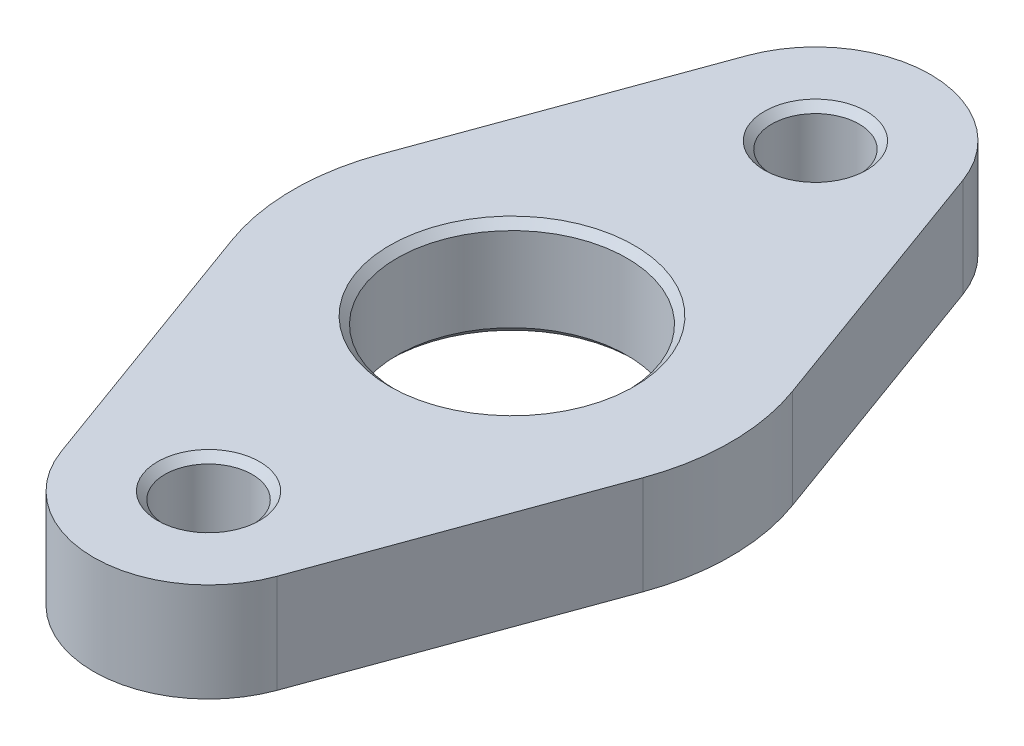
ISO-10303-21;
HEADER;
FILE_DESCRIPTION(('STEP AP214'),'2;1');
FILE_NAME('part.step','',(''),(''),'','','');
FILE_SCHEMA(('AUTOMOTIVE_DESIGN { 1 0 10303 214 1 1 1 1 }'));
ENDSEC;
DATA;
#1=APPLICATION_CONTEXT('core data for automotive mechanical design processes');
#2=APPLICATION_PROTOCOL_DEFINITION('international standard','automotive_design',2000,#1);
#3=PRODUCT_CONTEXT('',#1,'mechanical');
#4=PRODUCT('Part','Part','',(#3));
#5=PRODUCT_RELATED_PRODUCT_CATEGORY('part','',(#4));
#6=PRODUCT_DEFINITION_FORMATION('','',#4);
#7=PRODUCT_DEFINITION_CONTEXT('part definition',#1,'design');
#8=PRODUCT_DEFINITION('design','',#6,#7);
#9=PRODUCT_DEFINITION_SHAPE('','',#8);
#10=(LENGTH_UNIT() NAMED_UNIT(*) SI_UNIT(.MILLI.,.METRE.));
#11=(NAMED_UNIT(*) PLANE_ANGLE_UNIT() SI_UNIT($,.RADIAN.));
#12=(NAMED_UNIT(*) SI_UNIT($,.STERADIAN.) SOLID_ANGLE_UNIT());
#13=UNCERTAINTY_MEASURE_WITH_UNIT(LENGTH_MEASURE(1.E-05),#10,'distance_accuracy_value','');
#14=(GEOMETRIC_REPRESENTATION_CONTEXT(3) GLOBAL_UNCERTAINTY_ASSIGNED_CONTEXT((#13)) GLOBAL_UNIT_ASSIGNED_CONTEXT((#10,
#11,#12)) REPRESENTATION_CONTEXT('',''));
#15=CARTESIAN_POINT('',(0.,0.,0.));
#16=DIRECTION('',(0.,0.,1.));
#17=DIRECTION('',(1.,0.,0.));
#18=AXIS2_PLACEMENT_3D('',#15,#16,#17);
#19=CARTESIAN_POINT('',(95.885,80.772,-33.528));
#20=DIRECTION('',(0.,1.,0.));
#21=DIRECTION('',(0.,0.,1.));
#22=AXIS2_PLACEMENT_3D('',#19,#20,#21);
#23=PLANE('',#22);
#24=CARTESIAN_POINT('',(95.885,80.772,0.));
#25=DIRECTION('',(0.,1.,0.));
#26=DIRECTION('',(0.,0.,1.));
#27=AXIS2_PLACEMENT_3D('',#24,#25,#26);
#28=CIRCLE('',#27,13.5128);
#29=CARTESIAN_POINT('',(95.885,80.772,13.5128));
#30=VERTEX_POINT('',#29);
#31=EDGE_CURVE('E254',#30,#30,#28,.F.);
#32=ORIENTED_EDGE('',*,*,#31,.T.);
#33=EDGE_LOOP('',(#32));
#34=FACE_BOUND('',#33,.T.);
#35=CARTESIAN_POINT('',(95.885,80.772,-33.528));
#36=DIRECTION('',(0.,1.,0.));
#37=DIRECTION('',(0.,0.,1.));
#38=AXIS2_PLACEMENT_3D('',#35,#36,#37);
#39=CIRCLE('',#38,5.63879999999996);
#40=CARTESIAN_POINT('',(95.885,80.772,-27.8892));
#41=VERTEX_POINT('',#40);
#42=EDGE_CURVE('E250',#41,#41,#39,.F.);
#43=ORIENTED_EDGE('',*,*,#42,.T.);
#44=EDGE_LOOP('',(#43));
#45=FACE_BOUND('',#44,.T.);
#46=CARTESIAN_POINT('',(95.8850000000005,80.772,33.528));
#47=DIRECTION('',(0.,1.,0.));
#48=DIRECTION('',(0.,0.,1.));
#49=AXIS2_PLACEMENT_3D('',#46,#47,#48);
#50=CIRCLE('',#49,5.63879999999996);
#51=CARTESIAN_POINT('',(95.8850000000005,80.772,39.1668));
#52=VERTEX_POINT('',#51);
#53=EDGE_CURVE('E246',#52,#52,#50,.F.);
#54=ORIENTED_EDGE('',*,*,#53,.T.);
#55=EDGE_LOOP('',(#54));
#56=FACE_BOUND('',#55,.T.);
#57=CARTESIAN_POINT('',(95.885,80.772,-33.528));
#58=DIRECTION('',(0.,1.,0.));
#59=DIRECTION('',(0.,0.,1.));
#60=AXIS2_PLACEMENT_3D('',#57,#58,#59);
#61=CIRCLE('',#60,12.7);
#62=CARTESIAN_POINT('',(107.819096283981,80.772,-37.8716558202359));
#63=VERTEX_POINT('',#62);
#64=CARTESIAN_POINT('',(83.9509037160189,80.772,-37.8716558202359));
#65=VERTEX_POINT('',#64);
#66=EDGE_CURVE('E204',#63,#65,#61,.T.);
#67=ORIENTED_EDGE('',*,*,#66,.T.);
#68=DIRECTION('',(-0.342020143325663,0.,0.93969262078591));
#69=VECTOR('',#68,1.);
#70=CARTESIAN_POINT('',(83.9509037160189,80.772,-37.8716558202359));
#71=LINE('',#70,#69);
#72=CARTESIAN_POINT('',(73.1705749853587,80.772,-8.25294605844847));
#73=VERTEX_POINT('',#72);
#74=EDGE_CURVE('E142',#65,#73,#71,.T.);
#75=ORIENTED_EDGE('',*,*,#74,.T.);
#76=CARTESIAN_POINT('',(95.8453579249226,80.772,0.));
#77=DIRECTION('',(0.,1.,0.));
#78=DIRECTION('',(0.,0.,1.));
#79=AXIS2_PLACEMENT_3D('',#76,#77,#78);
#80=CIRCLE('',#79,24.13);
#81=CARTESIAN_POINT('',(73.1705749853588,80.772,8.25294605844846));
#82=VERTEX_POINT('',#81);
#83=EDGE_CURVE('E378',#73,#82,#80,.T.);
#84=ORIENTED_EDGE('',*,*,#83,.T.);
#85=DIRECTION('',(0.342020143325675,0.,0.939692620785906));
#86=VECTOR('',#85,1.);
#87=CARTESIAN_POINT('',(73.1705749853588,80.772,8.25294605844846));
#88=LINE('',#87,#86);
#89=CARTESIAN_POINT('',(83.9509037160195,80.772,37.8716558202361));
#90=VERTEX_POINT('',#89);
#91=EDGE_CURVE('E383',#82,#90,#88,.T.);
#92=ORIENTED_EDGE('',*,*,#91,.T.);
#93=CARTESIAN_POINT('',(95.8850000000005,80.772,33.528));
#94=DIRECTION('',(0.,1.,0.));
#95=DIRECTION('',(0.,0.,1.));
#96=AXIS2_PLACEMENT_3D('',#93,#94,#95);
#97=CIRCLE('',#96,12.7);
#98=CARTESIAN_POINT('',(107.819096283982,80.772,37.8716558202358));
#99=VERTEX_POINT('',#98);
#100=EDGE_CURVE('E160',#90,#99,#97,.T.);
#101=ORIENTED_EDGE('',*,*,#100,.T.);
#102=DIRECTION('',(0.342020143325651,0.,-0.939692620785915));
#103=VECTOR('',#102,1.);
#104=CARTESIAN_POINT('',(107.819096283982,80.772,37.8716558202358));
#105=LINE('',#104,#103);
#106=CARTESIAN_POINT('',(118.599425014641,80.772,8.25294605844822));
#107=VERTEX_POINT('',#106);
#108=EDGE_CURVE('E155',#99,#107,#105,.T.);
#109=ORIENTED_EDGE('',*,*,#108,.T.);
#110=CARTESIAN_POINT('',(95.9246420750774,80.772,1.45870710840934E-13));
#111=DIRECTION('',(0.,1.,0.));
#112=DIRECTION('',(0.,0.,1.));
#113=AXIS2_PLACEMENT_3D('',#110,#111,#112);
#114=CIRCLE('',#113,24.13);
#115=CARTESIAN_POINT('',(118.599425014641,80.772,-8.25294605844819));
#116=VERTEX_POINT('',#115);
#117=EDGE_CURVE('E158',#107,#116,#114,.T.);
#118=ORIENTED_EDGE('',*,*,#117,.T.);
#119=DIRECTION('',(-0.342020143325663,0.,-0.939692620785911));
#120=VECTOR('',#119,1.);
#121=CARTESIAN_POINT('',(118.599425014641,80.772,-8.25294605844819));
#122=LINE('',#121,#120);
#123=EDGE_CURVE('E98',#116,#63,#122,.T.);
#124=ORIENTED_EDGE('',*,*,#123,.T.);
#125=EDGE_LOOP('',(#67,#75,#84,#92,#101,#109,#118,#124));
#126=FACE_BOUND('',#125,.T.);
#127=ADVANCED_FACE('F79',(#34,#45,#56,#126),#23,.T.);
#128=CARTESIAN_POINT('',(95.885,69.85,-33.528));
#129=DIRECTION('',(0.,1.,0.));
#130=DIRECTION('',(0.,0.,1.));
#131=AXIS2_PLACEMENT_3D('',#128,#129,#130);
#132=PLANE('',#131);
#133=CARTESIAN_POINT('',(95.885,69.85,0.));
#134=DIRECTION('',(0.,1.,0.));
#135=DIRECTION('',(0.,0.,1.));
#136=AXIS2_PLACEMENT_3D('',#133,#134,#135);
#137=CIRCLE('',#136,13.5128);
#138=CARTESIAN_POINT('',(95.885,69.85,13.5128));
#139=VERTEX_POINT('',#138);
#140=EDGE_CURVE('E234',#139,#139,#137,.T.);
#141=ORIENTED_EDGE('',*,*,#140,.T.);
#142=EDGE_LOOP('',(#141));
#143=FACE_BOUND('',#142,.T.);
#144=CARTESIAN_POINT('',(95.885,69.85,-33.528));
#145=DIRECTION('',(0.,1.,0.));
#146=DIRECTION('',(0.,0.,1.));
#147=AXIS2_PLACEMENT_3D('',#144,#145,#146);
#148=CIRCLE('',#147,5.6388);
#149=CARTESIAN_POINT('',(95.885,69.85,-27.8892));
#150=VERTEX_POINT('',#149);
#151=EDGE_CURVE('E230',#150,#150,#148,.T.);
#152=ORIENTED_EDGE('',*,*,#151,.T.);
#153=EDGE_LOOP('',(#152));
#154=FACE_BOUND('',#153,.T.);
#155=CARTESIAN_POINT('',(95.8850000000005,69.85,33.528));
#156=DIRECTION('',(0.,1.,0.));
#157=DIRECTION('',(0.,0.,1.));
#158=AXIS2_PLACEMENT_3D('',#155,#156,#157);
#159=CIRCLE('',#158,5.6388);
#160=CARTESIAN_POINT('',(95.8850000000005,69.85,39.1668));
#161=VERTEX_POINT('',#160);
#162=EDGE_CURVE('E226',#161,#161,#159,.T.);
#163=ORIENTED_EDGE('',*,*,#162,.T.);
#164=EDGE_LOOP('',(#163));
#165=FACE_BOUND('',#164,.T.);
#166=CARTESIAN_POINT('',(95.885,69.85,-33.528));
#167=DIRECTION('',(0.,1.,0.));
#168=DIRECTION('',(0.,0.,1.));
#169=AXIS2_PLACEMENT_3D('',#166,#167,#168);
#170=CIRCLE('',#169,12.7);
#171=CARTESIAN_POINT('',(107.819096283981,69.85,-37.8716558202359));
#172=VERTEX_POINT('',#171);
#173=CARTESIAN_POINT('',(83.9509037160189,69.85,-37.8716558202359));
#174=VERTEX_POINT('',#173);
#175=EDGE_CURVE('E182',#172,#174,#170,.T.);
#176=ORIENTED_EDGE('',*,*,#175,.F.);
#177=DIRECTION('',(-0.342020143325663,0.,-0.939692620785911));
#178=VECTOR('',#177,1.);
#179=CARTESIAN_POINT('',(118.599425014641,69.85,-8.25294605844819));
#180=LINE('',#179,#178);
#181=CARTESIAN_POINT('',(118.599425014641,69.85,-8.25294605844819));
#182=VERTEX_POINT('',#181);
#183=EDGE_CURVE('E133',#182,#172,#180,.T.);
#184=ORIENTED_EDGE('',*,*,#183,.F.);
#185=CARTESIAN_POINT('',(95.9246420750774,69.85,1.45870710840934E-13));
#186=DIRECTION('',(0.,1.,0.));
#187=DIRECTION('',(0.,0.,1.));
#188=AXIS2_PLACEMENT_3D('',#185,#186,#187);
#189=CIRCLE('',#188,24.13);
#190=CARTESIAN_POINT('',(118.599425014641,69.85,8.25294605844822));
#191=VERTEX_POINT('',#190);
#192=EDGE_CURVE('E127',#191,#182,#189,.T.);
#193=ORIENTED_EDGE('',*,*,#192,.F.);
#194=DIRECTION('',(0.342020143325651,0.,-0.939692620785915));
#195=VECTOR('',#194,1.);
#196=CARTESIAN_POINT('',(107.819096283982,69.85,37.8716558202358));
#197=LINE('',#196,#195);
#198=CARTESIAN_POINT('',(107.819096283982,69.85,37.8716558202358));
#199=VERTEX_POINT('',#198);
#200=EDGE_CURVE('E169',#199,#191,#197,.T.);
#201=ORIENTED_EDGE('',*,*,#200,.F.);
#202=CARTESIAN_POINT('',(95.8850000000005,69.85,33.528));
#203=DIRECTION('',(0.,1.,0.));
#204=DIRECTION('',(0.,0.,1.));
#205=AXIS2_PLACEMENT_3D('',#202,#203,#204);
#206=CIRCLE('',#205,12.7);
#207=CARTESIAN_POINT('',(83.9509037160195,69.85,37.8716558202361));
#208=VERTEX_POINT('',#207);
#209=EDGE_CURVE('E195',#208,#199,#206,.T.);
#210=ORIENTED_EDGE('',*,*,#209,.F.);
#211=DIRECTION('',(0.342020143325675,0.,0.939692620785906));
#212=VECTOR('',#211,1.);
#213=CARTESIAN_POINT('',(73.1705749853588,69.85,8.25294605844846));
#214=LINE('',#213,#212);
#215=CARTESIAN_POINT('',(73.1705749853588,69.85,8.25294605844846));
#216=VERTEX_POINT('',#215);
#217=EDGE_CURVE('E192',#216,#208,#214,.T.);
#218=ORIENTED_EDGE('',*,*,#217,.F.);
#219=CARTESIAN_POINT('',(95.8453579249226,69.85,0.));
#220=DIRECTION('',(0.,1.,0.));
#221=DIRECTION('',(0.,0.,1.));
#222=AXIS2_PLACEMENT_3D('',#219,#220,#221);
#223=CIRCLE('',#222,24.13);
#224=CARTESIAN_POINT('',(73.1705749853587,69.85,-8.25294605844847));
#225=VERTEX_POINT('',#224);
#226=EDGE_CURVE('E189',#225,#216,#223,.T.);
#227=ORIENTED_EDGE('',*,*,#226,.F.);
#228=DIRECTION('',(-0.342020143325663,0.,0.93969262078591));
#229=VECTOR('',#228,1.);
#230=CARTESIAN_POINT('',(83.9509037160189,69.85,-37.8716558202359));
#231=LINE('',#230,#229);
#232=EDGE_CURVE('E186',#174,#225,#231,.T.);
#233=ORIENTED_EDGE('',*,*,#232,.F.);
#234=EDGE_LOOP('',(#176,#184,#193,#201,#210,#218,#227,#233));
#235=FACE_BOUND('',#234,.T.);
#236=ADVANCED_FACE('F281',(#143,#154,#165,#235),#132,.F.);
#237=CARTESIAN_POINT('',(95.885,80.772,-33.528));
#238=DIRECTION('',(0.,-1.,0.));
#239=DIRECTION('',(0.,0.,-1.));
#240=AXIS2_PLACEMENT_3D('',#237,#238,#239);
#241=CYLINDRICAL_SURFACE('',#240,12.7);
#242=ORIENTED_EDGE('',*,*,#175,.T.);
#243=DIRECTION('',(0.,-1.,0.));
#244=VECTOR('',#243,1.);
#245=CARTESIAN_POINT('',(83.9509037160189,80.772,-37.8716558202359));
#246=LINE('',#245,#244);
#247=EDGE_CURVE('E223',#65,#174,#246,.T.);
#248=ORIENTED_EDGE('',*,*,#247,.F.);
#249=ORIENTED_EDGE('',*,*,#66,.F.);
#250=DIRECTION('',(0.,-1.,0.));
#251=VECTOR('',#250,1.);
#252=CARTESIAN_POINT('',(107.819096283981,80.772,-37.8716558202359));
#253=LINE('',#252,#251);
#254=EDGE_CURVE('E178',#63,#172,#253,.T.);
#255=ORIENTED_EDGE('',*,*,#254,.T.);
#256=EDGE_LOOP('',(#242,#248,#249,#255));
#257=FACE_BOUND('',#256,.T.);
#258=ADVANCED_FACE('F287',(#257),#241,.T.);
#259=CARTESIAN_POINT('',(83.9509037160189,80.772,-37.8716558202359));
#260=DIRECTION('',(0.93969262078591,0.,0.342020143325663));
#261=DIRECTION('',(0.342020143325663,0.,-0.939692620785911));
#262=AXIS2_PLACEMENT_3D('',#259,#260,#261);
#263=PLANE('',#262);
#264=ORIENTED_EDGE('',*,*,#232,.T.);
#265=DIRECTION('',(0.,-1.,0.));
#266=VECTOR('',#265,1.);
#267=CARTESIAN_POINT('',(73.1705749853587,80.772,-8.25294605844847));
#268=LINE('',#267,#266);
#269=EDGE_CURVE('E219',#73,#225,#268,.T.);
#270=ORIENTED_EDGE('',*,*,#269,.F.);
#271=ORIENTED_EDGE('',*,*,#74,.F.);
#272=ORIENTED_EDGE('',*,*,#247,.T.);
#273=EDGE_LOOP('',(#264,#270,#271,#272));
#274=FACE_BOUND('',#273,.T.);
#275=ADVANCED_FACE('F313',(#274),#263,.F.);
#276=CARTESIAN_POINT('',(95.8453579249226,80.772,0.));
#277=DIRECTION('',(0.,-1.,0.));
#278=DIRECTION('',(0.,0.,-1.));
#279=AXIS2_PLACEMENT_3D('',#276,#277,#278);
#280=CYLINDRICAL_SURFACE('',#279,24.13);
#281=ORIENTED_EDGE('',*,*,#226,.T.);
#282=DIRECTION('',(0.,-1.,0.));
#283=VECTOR('',#282,1.);
#284=CARTESIAN_POINT('',(73.1705749853588,80.772,8.25294605844846));
#285=LINE('',#284,#283);
#286=EDGE_CURVE('E215',#82,#216,#285,.T.);
#287=ORIENTED_EDGE('',*,*,#286,.F.);
#288=ORIENTED_EDGE('',*,*,#83,.F.);
#289=ORIENTED_EDGE('',*,*,#269,.T.);
#290=EDGE_LOOP('',(#281,#287,#288,#289));
#291=FACE_BOUND('',#290,.T.);
#292=ADVANCED_FACE('F309',(#291),#280,.T.);
#293=CARTESIAN_POINT('',(73.1705749853588,80.772,8.25294605844846));
#294=DIRECTION('',(0.939692620785906,0.,-0.342020143325675));
#295=DIRECTION('',(-0.342020143325675,0.,-0.939692620785906));
#296=AXIS2_PLACEMENT_3D('',#293,#294,#295);
#297=PLANE('',#296);
#298=ORIENTED_EDGE('',*,*,#217,.T.);
#299=DIRECTION('',(0.,-1.,0.));
#300=VECTOR('',#299,1.);
#301=CARTESIAN_POINT('',(83.9509037160195,80.772,37.8716558202361));
#302=LINE('',#301,#300);
#303=EDGE_CURVE('E211',#90,#208,#302,.T.);
#304=ORIENTED_EDGE('',*,*,#303,.F.);
#305=ORIENTED_EDGE('',*,*,#91,.F.);
#306=ORIENTED_EDGE('',*,*,#286,.T.);
#307=EDGE_LOOP('',(#298,#304,#305,#306));
#308=FACE_BOUND('',#307,.T.);
#309=ADVANCED_FACE('F305',(#308),#297,.F.);
#310=CARTESIAN_POINT('',(95.8850000000005,80.772,33.528));
#311=DIRECTION('',(0.,-1.,0.));
#312=DIRECTION('',(0.,0.,-1.));
#313=AXIS2_PLACEMENT_3D('',#310,#311,#312);
#314=CYLINDRICAL_SURFACE('',#313,12.7);
#315=ORIENTED_EDGE('',*,*,#209,.T.);
#316=DIRECTION('',(0.,-1.,0.));
#317=VECTOR('',#316,1.);
#318=CARTESIAN_POINT('',(107.819096283982,80.772,37.8716558202358));
#319=LINE('',#318,#317);
#320=EDGE_CURVE('E171',#99,#199,#319,.T.);
#321=ORIENTED_EDGE('',*,*,#320,.F.);
#322=ORIENTED_EDGE('',*,*,#100,.F.);
#323=ORIENTED_EDGE('',*,*,#303,.T.);
#324=EDGE_LOOP('',(#315,#321,#322,#323));
#325=FACE_BOUND('',#324,.T.);
#326=ADVANCED_FACE('F302',(#325),#314,.T.);
#327=CARTESIAN_POINT('',(107.819096283982,80.772,37.8716558202358));
#328=DIRECTION('',(-0.939692620785915,0.,-0.342020143325651));
#329=DIRECTION('',(-0.342020143325651,0.,0.939692620785915));
#330=AXIS2_PLACEMENT_3D('',#327,#328,#329);
#331=PLANE('',#330);
#332=ORIENTED_EDGE('',*,*,#200,.T.);
#333=DIRECTION('',(0.,-1.,0.));
#334=VECTOR('',#333,1.);
#335=CARTESIAN_POINT('',(118.599425014641,80.772,8.25294605844822));
#336=LINE('',#335,#334);
#337=EDGE_CURVE('E166',#107,#191,#336,.T.);
#338=ORIENTED_EDGE('',*,*,#337,.F.);
#339=ORIENTED_EDGE('',*,*,#108,.F.);
#340=ORIENTED_EDGE('',*,*,#320,.T.);
#341=EDGE_LOOP('',(#332,#338,#339,#340));
#342=FACE_BOUND('',#341,.T.);
#343=ADVANCED_FACE('F167',(#342),#331,.F.);
#344=CARTESIAN_POINT('',(95.9246420750774,80.772,1.45870710840934E-13));
#345=DIRECTION('',(0.,-1.,0.));
#346=DIRECTION('',(0.,0.,-1.));
#347=AXIS2_PLACEMENT_3D('',#344,#345,#346);
#348=CYLINDRICAL_SURFACE('',#347,24.13);
#349=ORIENTED_EDGE('',*,*,#192,.T.);
#350=DIRECTION('',(0.,-1.,0.));
#351=VECTOR('',#350,1.);
#352=CARTESIAN_POINT('',(118.599425014641,80.772,-8.25294605844819));
#353=LINE('',#352,#351);
#354=EDGE_CURVE('E172',#116,#182,#353,.T.);
#355=ORIENTED_EDGE('',*,*,#354,.F.);
#356=ORIENTED_EDGE('',*,*,#117,.F.);
#357=ORIENTED_EDGE('',*,*,#337,.T.);
#358=EDGE_LOOP('',(#349,#355,#356,#357));
#359=FACE_BOUND('',#358,.T.);
#360=ADVANCED_FACE('F174',(#359),#348,.T.);
#361=CARTESIAN_POINT('',(118.599425014641,80.772,-8.25294605844819));
#362=DIRECTION('',(-0.939692620785911,0.,0.342020143325663));
#363=DIRECTION('',(0.342020143325663,0.,0.939692620785911));
#364=AXIS2_PLACEMENT_3D('',#361,#362,#363);
#365=PLANE('',#364);
#366=ORIENTED_EDGE('',*,*,#183,.T.);
#367=ORIENTED_EDGE('',*,*,#254,.F.);
#368=ORIENTED_EDGE('',*,*,#123,.F.);
#369=ORIENTED_EDGE('',*,*,#354,.T.);
#370=EDGE_LOOP('',(#366,#367,#368,#369));
#371=FACE_BOUND('',#370,.T.);
#372=ADVANCED_FACE('F295',(#371),#365,.F.);
#373=CARTESIAN_POINT('',(95.885,80.772,-33.528));
#374=DIRECTION('',(0.,-1.,0.));
#375=DIRECTION('',(0.,0.,-1.));
#376=AXIS2_PLACEMENT_3D('',#373,#374,#375);
#377=CYLINDRICAL_SURFACE('',#376,4.82599999999999);
#378=CARTESIAN_POINT('',(95.885,70.6628,-33.528));
#379=DIRECTION('',(0.,1.,0.));
#380=DIRECTION('',(0.,0.,1.));
#381=AXIS2_PLACEMENT_3D('',#378,#379,#380);
#382=CIRCLE('',#381,4.82599999999999);
#383=CARTESIAN_POINT('',(95.885,70.6628,-28.702));
#384=VERTEX_POINT('',#383);
#385=EDGE_CURVE('E262',#384,#384,#382,.F.);
#386=ORIENTED_EDGE('',*,*,#385,.T.);
#387=EDGE_LOOP('',(#386));
#388=FACE_BOUND('',#387,.T.);
#389=CARTESIAN_POINT('',(95.885,79.9592,-33.528));
#390=DIRECTION('',(0.,1.,0.));
#391=DIRECTION('',(0.,0.,1.));
#392=AXIS2_PLACEMENT_3D('',#389,#390,#391);
#393=CIRCLE('',#392,4.82599999999999);
#394=CARTESIAN_POINT('',(95.885,79.9592,-28.702));
#395=VERTEX_POINT('',#394);
#396=EDGE_CURVE('E258',#395,#395,#393,.T.);
#397=ORIENTED_EDGE('',*,*,#396,.T.);
#398=EDGE_LOOP('',(#397));
#399=FACE_BOUND('',#398,.T.);
#400=ADVANCED_FACE('F292',(#388,#399),#377,.F.);
#401=CARTESIAN_POINT('',(95.8850000000005,80.772,33.528));
#402=DIRECTION('',(0.,-1.,0.));
#403=DIRECTION('',(0.,0.,-1.));
#404=AXIS2_PLACEMENT_3D('',#401,#402,#403);
#405=CYLINDRICAL_SURFACE('',#404,4.82599999999999);
#406=CARTESIAN_POINT('',(95.8850000000005,70.6628,33.528));
#407=DIRECTION('',(0.,1.,0.));
#408=DIRECTION('',(0.,0.,1.));
#409=AXIS2_PLACEMENT_3D('',#406,#407,#408);
#410=CIRCLE('',#409,4.82599999999999);
#411=CARTESIAN_POINT('',(95.8850000000005,70.6628,38.354));
#412=VERTEX_POINT('',#411);
#413=EDGE_CURVE('E12',#412,#412,#410,.F.);
#414=ORIENTED_EDGE('',*,*,#413,.T.);
#415=EDGE_LOOP('',(#414));
#416=FACE_BOUND('',#415,.T.);
#417=CARTESIAN_POINT('',(95.8850000000005,79.9592,33.528));
#418=DIRECTION('',(0.,1.,0.));
#419=DIRECTION('',(0.,0.,1.));
#420=AXIS2_PLACEMENT_3D('',#417,#418,#419);
#421=CIRCLE('',#420,4.82599999999999);
#422=CARTESIAN_POINT('',(95.8850000000005,79.9592,38.354));
#423=VERTEX_POINT('',#422);
#424=EDGE_CURVE('E90',#423,#423,#421,.T.);
#425=ORIENTED_EDGE('',*,*,#424,.T.);
#426=EDGE_LOOP('',(#425));
#427=FACE_BOUND('',#426,.T.);
#428=ADVANCED_FACE('F269',(#416,#427),#405,.F.);
#429=CARTESIAN_POINT('',(95.885,80.772,0.));
#430=DIRECTION('',(0.,-1.,0.));
#431=DIRECTION('',(0.,0.,-1.));
#432=AXIS2_PLACEMENT_3D('',#429,#430,#431);
#433=CYLINDRICAL_SURFACE('',#432,12.7);
#434=CARTESIAN_POINT('',(95.885,70.6628,0.));
#435=DIRECTION('',(0.,1.,0.));
#436=DIRECTION('',(0.,0.,1.));
#437=AXIS2_PLACEMENT_3D('',#434,#435,#436);
#438=CIRCLE('',#437,12.7);
#439=CARTESIAN_POINT('',(95.885,70.6628,12.7));
#440=VERTEX_POINT('',#439);
#441=EDGE_CURVE('E242',#440,#440,#438,.F.);
#442=ORIENTED_EDGE('',*,*,#441,.T.);
#443=EDGE_LOOP('',(#442));
#444=FACE_BOUND('',#443,.T.);
#445=CARTESIAN_POINT('',(95.885,79.9592,0.));
#446=DIRECTION('',(0.,1.,0.));
#447=DIRECTION('',(0.,0.,1.));
#448=AXIS2_PLACEMENT_3D('',#445,#446,#447);
#449=CIRCLE('',#448,12.7);
#450=CARTESIAN_POINT('',(95.885,79.9592,12.7));
#451=VERTEX_POINT('',#450);
#452=EDGE_CURVE('E238',#451,#451,#449,.T.);
#453=ORIENTED_EDGE('',*,*,#452,.T.);
#454=EDGE_LOOP('',(#453));
#455=FACE_BOUND('',#454,.T.);
#456=ADVANCED_FACE('F328',(#444,#455),#433,.F.);
#457=CARTESIAN_POINT('',(95.885,69.85,0.));
#458=DIRECTION('',(0.,-1.,0.));
#459=DIRECTION('',(0.,0.,-1.));
#460=AXIS2_PLACEMENT_3D('',#457,#458,#459);
#461=CONICAL_SURFACE('',#460,13.5128,0.785398163397446);
#462=ORIENTED_EDGE('',*,*,#441,.F.);
#463=EDGE_LOOP('',(#462));
#464=FACE_BOUND('',#463,.T.);
#465=ORIENTED_EDGE('',*,*,#140,.F.);
#466=EDGE_LOOP('',(#465));
#467=FACE_BOUND('',#466,.T.);
#468=ADVANCED_FACE('F321',(#464,#467),#461,.F.);
#469=CARTESIAN_POINT('',(95.885,79.9592,0.));
#470=DIRECTION('',(0.,1.,0.));
#471=DIRECTION('',(0.,0.,1.));
#472=AXIS2_PLACEMENT_3D('',#469,#470,#471);
#473=CONICAL_SURFACE('',#472,12.7,0.78539816339744);
#474=ORIENTED_EDGE('',*,*,#31,.F.);
#475=EDGE_LOOP('',(#474));
#476=FACE_BOUND('',#475,.T.);
#477=ORIENTED_EDGE('',*,*,#452,.F.);
#478=EDGE_LOOP('',(#477));
#479=FACE_BOUND('',#478,.T.);
#480=ADVANCED_FACE('F327',(#476,#479),#473,.F.);
#481=CARTESIAN_POINT('',(95.885,69.85,-33.528));
#482=DIRECTION('',(0.,-1.,0.));
#483=DIRECTION('',(0.,0.,-1.));
#484=AXIS2_PLACEMENT_3D('',#481,#482,#483);
#485=CONICAL_SURFACE('',#484,5.6388,0.785398163397445);
#486=ORIENTED_EDGE('',*,*,#385,.F.);
#487=EDGE_LOOP('',(#486));
#488=FACE_BOUND('',#487,.T.);
#489=ORIENTED_EDGE('',*,*,#151,.F.);
#490=EDGE_LOOP('',(#489));
#491=FACE_BOUND('',#490,.T.);
#492=ADVANCED_FACE('F335',(#488,#491),#485,.F.);
#493=CARTESIAN_POINT('',(95.885,79.9592,-33.528));
#494=DIRECTION('',(0.,1.,0.));
#495=DIRECTION('',(0.,0.,1.));
#496=AXIS2_PLACEMENT_3D('',#493,#494,#495);
#497=CONICAL_SURFACE('',#496,4.82599999999999,0.785398163397445);
#498=ORIENTED_EDGE('',*,*,#42,.F.);
#499=EDGE_LOOP('',(#498));
#500=FACE_BOUND('',#499,.T.);
#501=ORIENTED_EDGE('',*,*,#396,.F.);
#502=EDGE_LOOP('',(#501));
#503=FACE_BOUND('',#502,.T.);
#504=ADVANCED_FACE('F277',(#500,#503),#497,.F.);
#505=CARTESIAN_POINT('',(95.8850000000005,69.85,33.528));
#506=DIRECTION('',(0.,-1.,0.));
#507=DIRECTION('',(0.,0.,-1.));
#508=AXIS2_PLACEMENT_3D('',#505,#506,#507);
#509=CONICAL_SURFACE('',#508,5.6388,0.785398163397445);
#510=ORIENTED_EDGE('',*,*,#413,.F.);
#511=EDGE_LOOP('',(#510));
#512=FACE_BOUND('',#511,.T.);
#513=ORIENTED_EDGE('',*,*,#162,.F.);
#514=EDGE_LOOP('',(#513));
#515=FACE_BOUND('',#514,.T.);
#516=ADVANCED_FACE('F272',(#512,#515),#509,.F.);
#517=CARTESIAN_POINT('',(95.8850000000005,79.9592,33.528));
#518=DIRECTION('',(0.,1.,0.));
#519=DIRECTION('',(0.,0.,1.));
#520=AXIS2_PLACEMENT_3D('',#517,#518,#519);
#521=CONICAL_SURFACE('',#520,4.82599999999999,0.785398163397445);
#522=ORIENTED_EDGE('',*,*,#53,.F.);
#523=EDGE_LOOP('',(#522));
#524=FACE_BOUND('',#523,.T.);
#525=ORIENTED_EDGE('',*,*,#424,.F.);
#526=EDGE_LOOP('',(#525));
#527=FACE_BOUND('',#526,.T.);
#528=ADVANCED_FACE('F82',(#524,#527),#521,.F.);
#529=CLOSED_SHELL('',(#127,#236,#258,#275,#292,#309,#326,#343,#360,#372,#400,#428,#456,#468,
#480,#492,#504,#516,#528));
#530=MANIFOLD_SOLID_BREP('B2',#529);
#531=ADVANCED_BREP_SHAPE_REPRESENTATION('',(#18,#530),#14);
#532=SHAPE_DEFINITION_REPRESENTATION(#9,#531);
ENDSEC;
END-ISO-10303-21;
